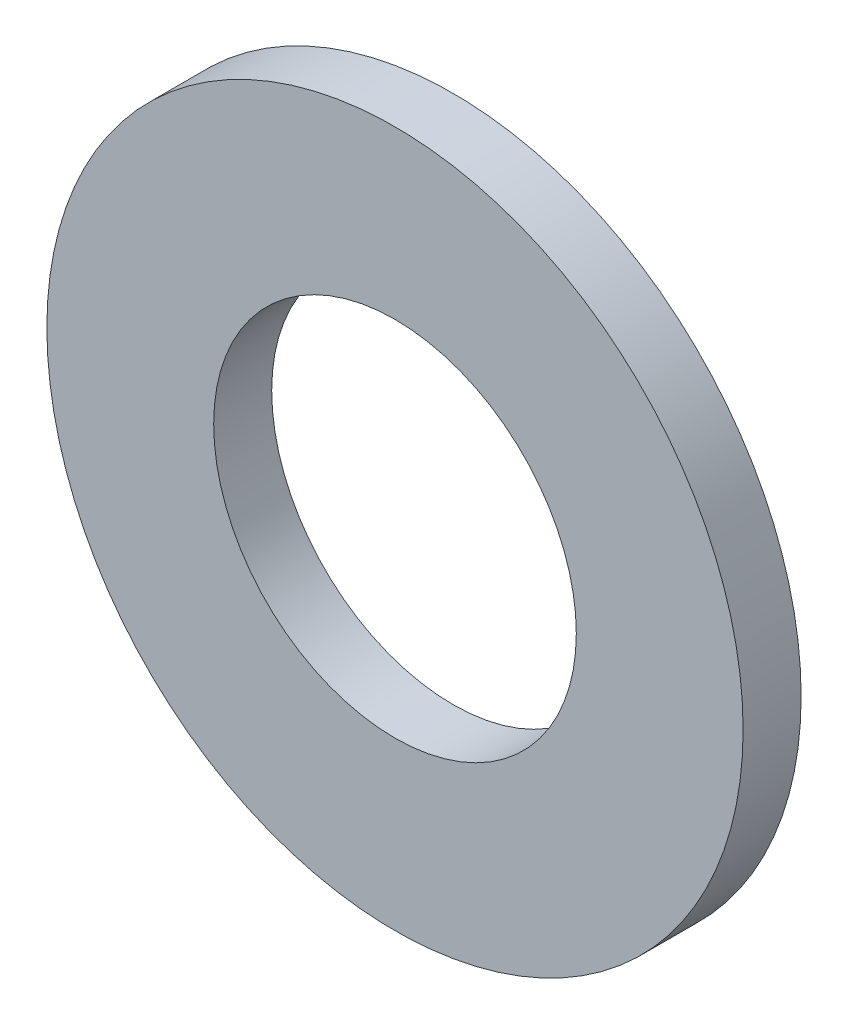
ISO-10303-21;
HEADER;
FILE_DESCRIPTION(('STEP AP214'),'2;1');
FILE_NAME('part.step','',(''),(''),'','','');
FILE_SCHEMA(('AUTOMOTIVE_DESIGN { 1 0 10303 214 1 1 1 1 }'));
ENDSEC;
DATA;
#1=APPLICATION_CONTEXT('core data for automotive mechanical design processes');
#2=APPLICATION_PROTOCOL_DEFINITION('international standard','automotive_design',2000,#1);
#3=PRODUCT_CONTEXT('',#1,'mechanical');
#4=PRODUCT('Part','Part','',(#3));
#5=PRODUCT_RELATED_PRODUCT_CATEGORY('part','',(#4));
#6=PRODUCT_DEFINITION_FORMATION('','',#4);
#7=PRODUCT_DEFINITION_CONTEXT('part definition',#1,'design');
#8=PRODUCT_DEFINITION('design','',#6,#7);
#9=PRODUCT_DEFINITION_SHAPE('','',#8);
#10=(LENGTH_UNIT() NAMED_UNIT(*) SI_UNIT(.MILLI.,.METRE.));
#11=(NAMED_UNIT(*) PLANE_ANGLE_UNIT() SI_UNIT($,.RADIAN.));
#12=(NAMED_UNIT(*) SI_UNIT($,.STERADIAN.) SOLID_ANGLE_UNIT());
#13=UNCERTAINTY_MEASURE_WITH_UNIT(LENGTH_MEASURE(1.E-05),#10,'distance_accuracy_value','');
#14=(GEOMETRIC_REPRESENTATION_CONTEXT(3) GLOBAL_UNCERTAINTY_ASSIGNED_CONTEXT((#13)) GLOBAL_UNIT_ASSIGNED_CONTEXT((#10,
#11,#12)) REPRESENTATION_CONTEXT('',''));
#15=CARTESIAN_POINT('',(0.,0.,0.));
#16=DIRECTION('',(0.,0.,1.));
#17=DIRECTION('',(1.,0.,0.));
#18=AXIS2_PLACEMENT_3D('',#15,#16,#17);
#19=CARTESIAN_POINT('',(0.,0.,0.5));
#20=DIRECTION('',(0.,0.,1.));
#21=DIRECTION('',(1.,0.,0.));
#22=AXIS2_PLACEMENT_3D('',#19,#20,#21);
#23=PLANE('',#22);
#24=CARTESIAN_POINT('',(0.,0.,0.5));
#25=DIRECTION('',(0.,0.,1.));
#26=DIRECTION('',(1.,0.,0.));
#27=AXIS2_PLACEMENT_3D('',#24,#25,#26);
#28=CIRCLE('',#27,6.);
#29=CARTESIAN_POINT('',(6.,0.,0.5));
#30=VERTEX_POINT('',#29);
#31=EDGE_CURVE('E10',#30,#30,#28,.T.);
#32=ORIENTED_EDGE('',*,*,#31,.T.);
#33=EDGE_LOOP('',(#32));
#34=FACE_BOUND('',#33,.T.);
#35=CARTESIAN_POINT('',(0.,0.,0.5));
#36=DIRECTION('',(0.,0.,1.));
#37=DIRECTION('',(1.,0.,0.));
#38=AXIS2_PLACEMENT_3D('',#35,#36,#37);
#39=CIRCLE('',#38,3.125);
#40=CARTESIAN_POINT('',(3.125,0.,0.5));
#41=VERTEX_POINT('',#40);
#42=EDGE_CURVE('E48',#41,#41,#39,.T.);
#43=ORIENTED_EDGE('',*,*,#42,.F.);
#44=EDGE_LOOP('',(#43));
#45=FACE_BOUND('',#44,.T.);
#46=ADVANCED_FACE('F40',(#34,#45),#23,.T.);
#47=CARTESIAN_POINT('',(0.,0.,-0.5));
#48=DIRECTION('',(0.,0.,1.));
#49=DIRECTION('',(1.,0.,0.));
#50=AXIS2_PLACEMENT_3D('',#47,#48,#49);
#51=PLANE('',#50);
#52=CARTESIAN_POINT('',(0.,0.,-0.5));
#53=DIRECTION('',(0.,0.,1.));
#54=DIRECTION('',(1.,0.,0.));
#55=AXIS2_PLACEMENT_3D('',#52,#53,#54);
#56=CIRCLE('',#55,6.);
#57=CARTESIAN_POINT('',(6.,0.,-0.5));
#58=VERTEX_POINT('',#57);
#59=EDGE_CURVE('E41',#58,#58,#56,.T.);
#60=ORIENTED_EDGE('',*,*,#59,.F.);
#61=EDGE_LOOP('',(#60));
#62=FACE_BOUND('',#61,.T.);
#63=CARTESIAN_POINT('',(0.,0.,-0.5));
#64=DIRECTION('',(0.,0.,1.));
#65=DIRECTION('',(1.,0.,0.));
#66=AXIS2_PLACEMENT_3D('',#63,#64,#65);
#67=CIRCLE('',#66,3.125);
#68=CARTESIAN_POINT('',(3.125,0.,-0.5));
#69=VERTEX_POINT('',#68);
#70=EDGE_CURVE('E49',#69,#69,#67,.T.);
#71=ORIENTED_EDGE('',*,*,#70,.T.);
#72=EDGE_LOOP('',(#71));
#73=FACE_BOUND('',#72,.T.);
#74=ADVANCED_FACE('F58',(#62,#73),#51,.F.);
#75=CARTESIAN_POINT('',(0.,0.,0.5));
#76=DIRECTION('',(0.,0.,-1.));
#77=DIRECTION('',(-1.,0.,0.));
#78=AXIS2_PLACEMENT_3D('',#75,#76,#77);
#79=CYLINDRICAL_SURFACE('',#78,6.);
#80=ORIENTED_EDGE('',*,*,#31,.F.);
#81=EDGE_LOOP('',(#80));
#82=FACE_BOUND('',#81,.T.);
#83=ORIENTED_EDGE('',*,*,#59,.T.);
#84=EDGE_LOOP('',(#83));
#85=FACE_BOUND('',#84,.T.);
#86=ADVANCED_FACE('F39',(#82,#85),#79,.T.);
#87=CARTESIAN_POINT('',(0.,0.,0.5));
#88=DIRECTION('',(0.,0.,-1.));
#89=DIRECTION('',(-1.,0.,0.));
#90=AXIS2_PLACEMENT_3D('',#87,#88,#89);
#91=CYLINDRICAL_SURFACE('',#90,3.125);
#92=ORIENTED_EDGE('',*,*,#42,.T.);
#93=EDGE_LOOP('',(#92));
#94=FACE_BOUND('',#93,.T.);
#95=ORIENTED_EDGE('',*,*,#70,.F.);
#96=EDGE_LOOP('',(#95));
#97=FACE_BOUND('',#96,.T.);
#98=ADVANCED_FACE('F57',(#94,#97),#91,.F.);
#99=CLOSED_SHELL('',(#46,#74,#86,#98));
#100=MANIFOLD_SOLID_BREP('B2',#99);
#101=ADVANCED_BREP_SHAPE_REPRESENTATION('',(#18,#100),#14);
#102=SHAPE_DEFINITION_REPRESENTATION(#9,#101);
ENDSEC;
END-ISO-10303-21;
